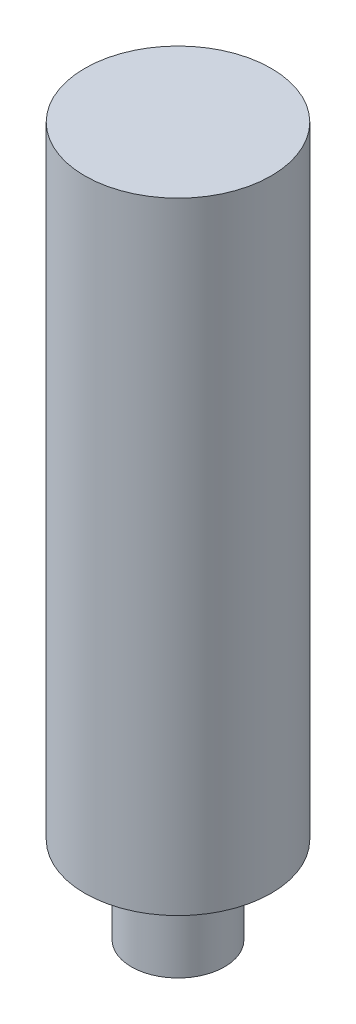
ISO-10303-21;
HEADER;
FILE_DESCRIPTION(('STEP AP214'),'2;1');
FILE_NAME('part.step','',(''),(''),'','','');
FILE_SCHEMA(('AUTOMOTIVE_DESIGN { 1 0 10303 214 1 1 1 1 }'));
ENDSEC;
DATA;
#1=APPLICATION_CONTEXT('core data for automotive mechanical design processes');
#2=APPLICATION_PROTOCOL_DEFINITION('international standard','automotive_design',2000,#1);
#3=PRODUCT_CONTEXT('',#1,'mechanical');
#4=PRODUCT('Part','Part','',(#3));
#5=PRODUCT_RELATED_PRODUCT_CATEGORY('part','',(#4));
#6=PRODUCT_DEFINITION_FORMATION('','',#4);
#7=PRODUCT_DEFINITION_CONTEXT('part definition',#1,'design');
#8=PRODUCT_DEFINITION('design','',#6,#7);
#9=PRODUCT_DEFINITION_SHAPE('','',#8);
#10=(LENGTH_UNIT() NAMED_UNIT(*) SI_UNIT(.MILLI.,.METRE.));
#11=(NAMED_UNIT(*) PLANE_ANGLE_UNIT() SI_UNIT($,.RADIAN.));
#12=(NAMED_UNIT(*) SI_UNIT($,.STERADIAN.) SOLID_ANGLE_UNIT());
#13=UNCERTAINTY_MEASURE_WITH_UNIT(LENGTH_MEASURE(1.E-05),#10,'distance_accuracy_value','');
#14=(GEOMETRIC_REPRESENTATION_CONTEXT(3) GLOBAL_UNCERTAINTY_ASSIGNED_CONTEXT((#13)) GLOBAL_UNIT_ASSIGNED_CONTEXT((#10,
#11,#12)) REPRESENTATION_CONTEXT('',''));
#15=CARTESIAN_POINT('',(0.,0.,0.));
#16=DIRECTION('',(0.,0.,1.));
#17=DIRECTION('',(1.,0.,0.));
#18=AXIS2_PLACEMENT_3D('',#15,#16,#17);
#19=CARTESIAN_POINT('',(0.,2.8,0.));
#20=DIRECTION('',(0.,-1.,0.));
#21=DIRECTION('',(0.,0.,-1.));
#22=AXIS2_PLACEMENT_3D('',#19,#20,#21);
#23=CYLINDRICAL_SURFACE('',#22,1.5);
#24=CARTESIAN_POINT('',(0.,2.8,0.));
#25=DIRECTION('',(0.,1.,0.));
#26=DIRECTION('',(0.,0.,1.));
#27=AXIS2_PLACEMENT_3D('',#24,#25,#26);
#28=CIRCLE('',#27,1.5);
#29=CARTESIAN_POINT('',(0.,2.8,1.5));
#30=VERTEX_POINT('',#29);
#31=EDGE_CURVE('E10',#30,#30,#28,.T.);
#32=ORIENTED_EDGE('',*,*,#31,.F.);
#33=EDGE_LOOP('',(#32));
#34=FACE_BOUND('',#33,.T.);
#35=CARTESIAN_POINT('',(0.,0.,0.));
#36=DIRECTION('',(0.,1.,0.));
#37=DIRECTION('',(0.,0.,1.));
#38=AXIS2_PLACEMENT_3D('',#35,#36,#37);
#39=CIRCLE('',#38,1.5);
#40=CARTESIAN_POINT('',(0.,0.,1.5));
#41=VERTEX_POINT('',#40);
#42=EDGE_CURVE('E42',#41,#41,#39,.T.);
#43=ORIENTED_EDGE('',*,*,#42,.T.);
#44=EDGE_LOOP('',(#43));
#45=FACE_BOUND('',#44,.T.);
#46=ADVANCED_FACE('F39',(#34,#45),#23,.T.);
#47=CARTESIAN_POINT('',(0.,0.,0.));
#48=DIRECTION('',(0.,1.,0.));
#49=DIRECTION('',(0.,0.,1.));
#50=AXIS2_PLACEMENT_3D('',#47,#48,#49);
#51=PLANE('',#50);
#52=ORIENTED_EDGE('',*,*,#42,.F.);
#53=EDGE_LOOP('',(#52));
#54=FACE_BOUND('',#53,.T.);
#55=ADVANCED_FACE('F66',(#54),#51,.F.);
#56=CARTESIAN_POINT('',(0.,22.8,0.));
#57=DIRECTION('',(0.,-1.,0.));
#58=DIRECTION('',(0.,0.,-1.));
#59=AXIS2_PLACEMENT_3D('',#56,#57,#58);
#60=CYLINDRICAL_SURFACE('',#59,3.);
#61=CARTESIAN_POINT('',(0.,22.8,0.));
#62=DIRECTION('',(0.,1.,0.));
#63=DIRECTION('',(0.,0.,1.));
#64=AXIS2_PLACEMENT_3D('',#61,#62,#63);
#65=CIRCLE('',#64,3.);
#66=CARTESIAN_POINT('',(0.,22.8,3.));
#67=VERTEX_POINT('',#66);
#68=EDGE_CURVE('E51',#67,#67,#65,.T.);
#69=ORIENTED_EDGE('',*,*,#68,.F.);
#70=EDGE_LOOP('',(#69));
#71=FACE_BOUND('',#70,.T.);
#72=CARTESIAN_POINT('',(0.,2.8,0.));
#73=DIRECTION('',(0.,1.,0.));
#74=DIRECTION('',(0.,0.,1.));
#75=AXIS2_PLACEMENT_3D('',#72,#73,#74);
#76=CIRCLE('',#75,3.);
#77=CARTESIAN_POINT('',(0.,2.8,3.));
#78=VERTEX_POINT('',#77);
#79=EDGE_CURVE('E53',#78,#78,#76,.T.);
#80=ORIENTED_EDGE('',*,*,#79,.T.);
#81=EDGE_LOOP('',(#80));
#82=FACE_BOUND('',#81,.T.);
#83=ADVANCED_FACE('F63',(#71,#82),#60,.T.);
#84=CARTESIAN_POINT('',(0.,22.8,0.));
#85=DIRECTION('',(0.,1.,0.));
#86=DIRECTION('',(0.,0.,1.));
#87=AXIS2_PLACEMENT_3D('',#84,#85,#86);
#88=PLANE('',#87);
#89=ORIENTED_EDGE('',*,*,#68,.T.);
#90=EDGE_LOOP('',(#89));
#91=FACE_BOUND('',#90,.T.);
#92=ADVANCED_FACE('F61',(#91),#88,.T.);
#93=CARTESIAN_POINT('',(0.,2.8,0.));
#94=DIRECTION('',(0.,1.,0.));
#95=DIRECTION('',(0.,0.,1.));
#96=AXIS2_PLACEMENT_3D('',#93,#94,#95);
#97=PLANE('',#96);
#98=ORIENTED_EDGE('',*,*,#31,.T.);
#99=EDGE_LOOP('',(#98));
#100=FACE_BOUND('',#99,.T.);
#101=ORIENTED_EDGE('',*,*,#79,.F.);
#102=EDGE_LOOP('',(#101));
#103=FACE_BOUND('',#102,.T.);
#104=ADVANCED_FACE('F70',(#100,#103),#97,.F.);
#105=CLOSED_SHELL('',(#46,#55,#83,#92,#104));
#106=MANIFOLD_SOLID_BREP('B2',#105);
#107=ADVANCED_BREP_SHAPE_REPRESENTATION('',(#18,#106),#14);
#108=SHAPE_DEFINITION_REPRESENTATION(#9,#107);
ENDSEC;
END-ISO-10303-21;
